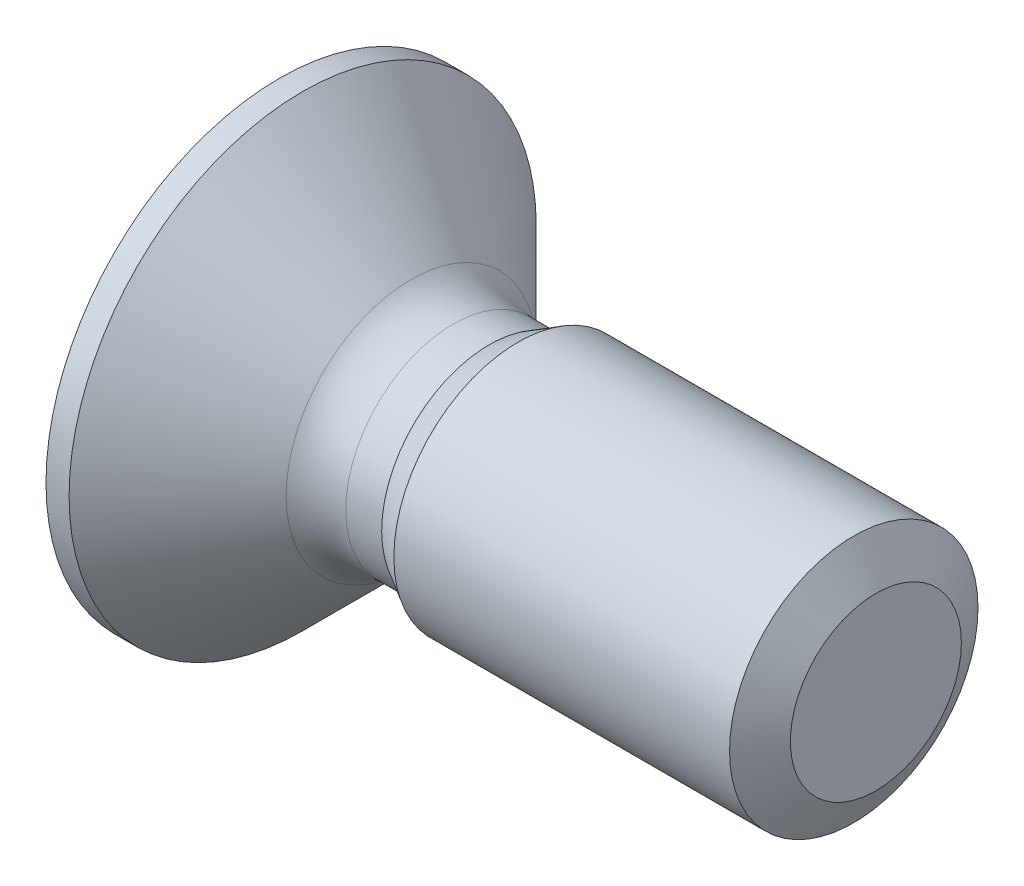
ISO-10303-21;
HEADER;
FILE_DESCRIPTION(('STEP AP214'),'2;1');
FILE_NAME('part.step','',(''),(''),'','','');
FILE_SCHEMA(('AUTOMOTIVE_DESIGN { 1 0 10303 214 1 1 1 1 }'));
ENDSEC;
DATA;
#1=APPLICATION_CONTEXT('core data for automotive mechanical design processes');
#2=APPLICATION_PROTOCOL_DEFINITION('international standard','automotive_design',2000,#1);
#3=PRODUCT_CONTEXT('',#1,'mechanical');
#4=PRODUCT('Part','Part','',(#3));
#5=PRODUCT_RELATED_PRODUCT_CATEGORY('part','',(#4));
#6=PRODUCT_DEFINITION_FORMATION('','',#4);
#7=PRODUCT_DEFINITION_CONTEXT('part definition',#1,'design');
#8=PRODUCT_DEFINITION('design','',#6,#7);
#9=PRODUCT_DEFINITION_SHAPE('','',#8);
#10=(LENGTH_UNIT() NAMED_UNIT(*) SI_UNIT(.MILLI.,.METRE.));
#11=(NAMED_UNIT(*) PLANE_ANGLE_UNIT() SI_UNIT($,.RADIAN.));
#12=(NAMED_UNIT(*) SI_UNIT($,.STERADIAN.) SOLID_ANGLE_UNIT());
#13=UNCERTAINTY_MEASURE_WITH_UNIT(LENGTH_MEASURE(1.E-05),#10,'distance_accuracy_value','');
#14=(GEOMETRIC_REPRESENTATION_CONTEXT(3) GLOBAL_UNCERTAINTY_ASSIGNED_CONTEXT((#13)) GLOBAL_UNIT_ASSIGNED_CONTEXT((#10,
#11,#12)) REPRESENTATION_CONTEXT('',''));
#15=CARTESIAN_POINT('',(0.,0.,0.));
#16=DIRECTION('',(0.,0.,1.));
#17=DIRECTION('',(1.,0.,0.));
#18=AXIS2_PLACEMENT_3D('',#15,#16,#17);
#19=CARTESIAN_POINT('',(0.,0.,0.));
#20=DIRECTION('',(1.,0.,0.));
#21=DIRECTION('',(0.,0.,-1.));
#22=AXIS2_PLACEMENT_3D('',#19,#20,#21);
#23=PLANE('',#22);
#24=CARTESIAN_POINT('',(0.,0.,0.));
#25=DIRECTION('',(-1.,0.,0.));
#26=DIRECTION('',(0.,0.,1.));
#27=AXIS2_PLACEMENT_3D('',#24,#25,#26);
#28=CIRCLE('',#27,2.35);
#29=CARTESIAN_POINT('',(0.,0.,2.35));
#30=VERTEX_POINT('',#29);
#31=EDGE_CURVE('E210',#30,#30,#28,.T.);
#32=ORIENTED_EDGE('',*,*,#31,.T.);
#33=EDGE_LOOP('',(#32));
#34=FACE_BOUND('',#33,.T.);
#35=DIRECTION('',(0.,1.,0.));
#36=VECTOR('',#35,1.);
#37=CARTESIAN_POINT('',(0.,1.45,0.225000000000005));
#38=LINE('',#37,#36);
#39=CARTESIAN_POINT('',(0.,0.225,0.225000000000001));
#40=VERTEX_POINT('',#39);
#41=CARTESIAN_POINT('',(0.,1.45,0.225000000000005));
#42=VERTEX_POINT('',#41);
#43=EDGE_CURVE('E108',#40,#42,#38,.T.);
#44=ORIENTED_EDGE('',*,*,#43,.F.);
#45=DIRECTION('',(0.,0.,-1.));
#46=VECTOR('',#45,1.);
#47=CARTESIAN_POINT('',(0.,0.225,-1.45));
#48=LINE('',#47,#46);
#49=CARTESIAN_POINT('',(0.,0.225,1.45));
#50=VERTEX_POINT('',#49);
#51=EDGE_CURVE('E166',#50,#40,#48,.T.);
#52=ORIENTED_EDGE('',*,*,#51,.F.);
#53=DIRECTION('',(0.,1.,0.));
#54=VECTOR('',#53,1.);
#55=CARTESIAN_POINT('',(0.,0.225,1.45));
#56=LINE('',#55,#54);
#57=CARTESIAN_POINT('',(0.,-0.225,1.45));
#58=VERTEX_POINT('',#57);
#59=EDGE_CURVE('E162',#58,#50,#56,.T.);
#60=ORIENTED_EDGE('',*,*,#59,.F.);
#61=DIRECTION('',(0.,0.,1.));
#62=VECTOR('',#61,1.);
#63=CARTESIAN_POINT('',(0.,-0.225,-1.45));
#64=LINE('',#63,#62);
#65=CARTESIAN_POINT('',(0.,-0.225,0.224999999999999));
#66=VERTEX_POINT('',#65);
#67=EDGE_CURVE('E81',#66,#58,#64,.T.);
#68=ORIENTED_EDGE('',*,*,#67,.F.);
#69=CARTESIAN_POINT('',(0.,-1.45,0.224999999999995));
#70=VERTEX_POINT('',#69);
#71=EDGE_CURVE('E117',#70,#66,#38,.T.);
#72=ORIENTED_EDGE('',*,*,#71,.F.);
#73=DIRECTION('',(0.,0.,1.));
#74=VECTOR('',#73,1.);
#75=CARTESIAN_POINT('',(0.,-1.45,0.224999999999995));
#76=LINE('',#75,#74);
#77=CARTESIAN_POINT('',(0.,-1.45,-0.225000000000005));
#78=VERTEX_POINT('',#77);
#79=EDGE_CURVE('E118',#78,#70,#76,.T.);
#80=ORIENTED_EDGE('',*,*,#79,.F.);
#81=DIRECTION('',(0.,-1.,0.));
#82=VECTOR('',#81,1.);
#83=CARTESIAN_POINT('',(0.,1.45,-0.224999999999995));
#84=LINE('',#83,#82);
#85=CARTESIAN_POINT('',(0.,-0.225,-0.225000000000001));
#86=VERTEX_POINT('',#85);
#87=EDGE_CURVE('E133',#86,#78,#84,.T.);
#88=ORIENTED_EDGE('',*,*,#87,.F.);
#89=CARTESIAN_POINT('',(0.,-0.225,-1.45));
#90=VERTEX_POINT('',#89);
#91=EDGE_CURVE('E158',#90,#86,#64,.T.);
#92=ORIENTED_EDGE('',*,*,#91,.F.);
#93=DIRECTION('',(0.,-1.,0.));
#94=VECTOR('',#93,1.);
#95=CARTESIAN_POINT('',(0.,0.225,-1.45));
#96=LINE('',#95,#94);
#97=CARTESIAN_POINT('',(0.,0.225,-1.45));
#98=VERTEX_POINT('',#97);
#99=EDGE_CURVE('E58',#98,#90,#96,.T.);
#100=ORIENTED_EDGE('',*,*,#99,.F.);
#101=CARTESIAN_POINT('',(0.,0.225,-0.224999999999999));
#102=VERTEX_POINT('',#101);
#103=EDGE_CURVE('E170',#102,#98,#48,.T.);
#104=ORIENTED_EDGE('',*,*,#103,.F.);
#105=CARTESIAN_POINT('',(0.,1.45,-0.224999999999995));
#106=VERTEX_POINT('',#105);
#107=EDGE_CURVE('E131',#106,#102,#84,.T.);
#108=ORIENTED_EDGE('',*,*,#107,.F.);
#109=DIRECTION('',(0.,0.,-1.));
#110=VECTOR('',#109,1.);
#111=CARTESIAN_POINT('',(0.,1.45,0.225000000000005));
#112=LINE('',#111,#110);
#113=EDGE_CURVE('E123',#42,#106,#112,.T.);
#114=ORIENTED_EDGE('',*,*,#113,.F.);
#115=EDGE_LOOP('',(#44,#52,#60,#68,#72,#80,#88,#92,#100,#104,#108,#114));
#116=FACE_BOUND('',#115,.T.);
#117=ADVANCED_FACE('F43',(#34,#116),#23,.F.);
#118=CARTESIAN_POINT('',(1.8,0.,0.));
#119=DIRECTION('',(-0.124034734589208,-0.992277876713668,0.));
#120=DIRECTION('',(0.992277876713668,-0.124034734589208,0.));
#121=AXIS2_PLACEMENT_3D('',#118,#119,#120);
#122=PLANE('',#121);
#123=ORIENTED_EDGE('',*,*,#51,.T.);
#124=DIRECTION('',(0.984731927834662,-0.123091490979333,-0.123091490979333));
#125=VECTOR('',#124,1.);
#126=CARTESIAN_POINT('',(1.8,0.,0.));
#127=LINE('',#126,#125);
#128=CARTESIAN_POINT('',(1.8,0.,0.));
#129=VERTEX_POINT('',#128);
#130=EDGE_CURVE('E87',#40,#129,#127,.T.);
#131=ORIENTED_EDGE('',*,*,#130,.T.);
#132=DIRECTION('',(0.775090228729781,-0.0968862785912226,-0.624378239810101));
#133=VECTOR('',#132,1.);
#134=CARTESIAN_POINT('',(0.,0.225,1.45));
#135=LINE('',#134,#133);
#136=EDGE_CURVE('E67',#50,#129,#135,.T.);
#137=ORIENTED_EDGE('',*,*,#136,.F.);
#138=EDGE_LOOP('',(#123,#131,#137));
#139=FACE_BOUND('',#138,.T.);
#140=ADVANCED_FACE('F228',(#139),#122,.T.);
#141=DIRECTION('',(0.775090228729781,-0.0968862785912226,0.624378239810101));
#142=VECTOR('',#141,1.);
#143=CARTESIAN_POINT('',(0.,0.225,-1.45));
#144=LINE('',#143,#142);
#145=EDGE_CURVE('E165',#98,#129,#144,.T.);
#146=ORIENTED_EDGE('',*,*,#145,.T.);
#147=DIRECTION('',(-0.984731927834662,0.123091490979333,-0.123091490979332));
#148=VECTOR('',#147,1.);
#149=CARTESIAN_POINT('',(1.8,0.,0.));
#150=LINE('',#149,#148);
#151=EDGE_CURVE('E139',#129,#102,#150,.T.);
#152=ORIENTED_EDGE('',*,*,#151,.T.);
#153=ORIENTED_EDGE('',*,*,#103,.T.);
#154=EDGE_LOOP('',(#146,#152,#153));
#155=FACE_BOUND('',#154,.T.);
#156=ADVANCED_FACE('F222',(#155),#122,.T.);
#157=CARTESIAN_POINT('',(1.8,0.,0.));
#158=DIRECTION('',(-0.124034734589208,0.992277876713668,0.));
#159=DIRECTION('',(-0.992277876713668,-0.124034734589208,0.));
#160=AXIS2_PLACEMENT_3D('',#157,#158,#159);
#161=PLANE('',#160);
#162=DIRECTION('',(0.775090228729781,0.0968862785912226,-0.624378239810101));
#163=VECTOR('',#162,1.);
#164=CARTESIAN_POINT('',(0.,-0.225,1.45));
#165=LINE('',#164,#163);
#166=EDGE_CURVE('E157',#58,#129,#165,.T.);
#167=ORIENTED_EDGE('',*,*,#166,.T.);
#168=DIRECTION('',(-0.984731927834662,-0.123091490979333,0.123091490979332));
#169=VECTOR('',#168,1.);
#170=CARTESIAN_POINT('',(1.8,0.,0.));
#171=LINE('',#170,#169);
#172=EDGE_CURVE('E11',#129,#66,#171,.T.);
#173=ORIENTED_EDGE('',*,*,#172,.T.);
#174=ORIENTED_EDGE('',*,*,#67,.T.);
#175=EDGE_LOOP('',(#167,#173,#174));
#176=FACE_BOUND('',#175,.T.);
#177=ADVANCED_FACE('F223',(#176),#161,.T.);
#178=ORIENTED_EDGE('',*,*,#91,.T.);
#179=DIRECTION('',(0.984731927834662,0.123091490979333,0.123091490979333));
#180=VECTOR('',#179,1.);
#181=CARTESIAN_POINT('',(1.8,0.,0.));
#182=LINE('',#181,#180);
#183=EDGE_CURVE('E51',#86,#129,#182,.T.);
#184=ORIENTED_EDGE('',*,*,#183,.T.);
#185=DIRECTION('',(0.775090228729781,0.0968862785912226,0.624378239810101));
#186=VECTOR('',#185,1.);
#187=CARTESIAN_POINT('',(0.,-0.225,-1.45));
#188=LINE('',#187,#186);
#189=EDGE_CURVE('E178',#90,#129,#188,.T.);
#190=ORIENTED_EDGE('',*,*,#189,.F.);
#191=EDGE_LOOP('',(#178,#184,#190));
#192=FACE_BOUND('',#191,.T.);
#193=ADVANCED_FACE('F216',(#192),#161,.T.);
#194=CARTESIAN_POINT('',(0.,0.,0.));
#195=DIRECTION('',(-1.,0.,0.));
#196=DIRECTION('',(0.,0.,1.));
#197=AXIS2_PLACEMENT_3D('',#194,#195,#196);
#198=CYLINDRICAL_SURFACE('',#197,2.35);
#199=ORIENTED_EDGE('',*,*,#31,.F.);
#200=EDGE_LOOP('',(#199));
#201=FACE_BOUND('',#200,.T.);
#202=CARTESIAN_POINT('',(0.232500000000005,0.,0.));
#203=DIRECTION('',(-1.,0.,0.));
#204=DIRECTION('',(0.,0.,1.));
#205=AXIS2_PLACEMENT_3D('',#202,#203,#204);
#206=CIRCLE('',#205,2.35);
#207=CARTESIAN_POINT('',(0.232500000000005,0.,2.35));
#208=VERTEX_POINT('',#207);
#209=EDGE_CURVE('E206',#208,#208,#206,.T.);
#210=ORIENTED_EDGE('',*,*,#209,.T.);
#211=EDGE_LOOP('',(#210));
#212=FACE_BOUND('',#211,.T.);
#213=ADVANCED_FACE('F259',(#201,#212),#198,.T.);
#214=CARTESIAN_POINT('',(1.32426406871193,0.,0.));
#215=DIRECTION('',(-1.,0.,0.));
#216=DIRECTION('',(0.,0.,1.));
#217=AXIS2_PLACEMENT_3D('',#214,#215,#216);
#218=CONICAL_SURFACE('',#217,1.25823593128807,0.78539816339745);
#219=ORIENTED_EDGE('',*,*,#209,.F.);
#220=EDGE_LOOP('',(#219));
#221=FACE_BOUND('',#220,.T.);
#222=CARTESIAN_POINT('',(1.32426406871193,0.,0.));
#223=DIRECTION('',(-1.,0.,0.));
#224=DIRECTION('',(0.,0.,1.));
#225=AXIS2_PLACEMENT_3D('',#222,#223,#224);
#226=CIRCLE('',#225,1.25823593128807);
#227=CARTESIAN_POINT('',(1.32426406871193,0.,1.25823593128807));
#228=VERTEX_POINT('',#227);
#229=EDGE_CURVE('E202',#228,#228,#226,.T.);
#230=ORIENTED_EDGE('',*,*,#229,.T.);
#231=EDGE_LOOP('',(#230));
#232=FACE_BOUND('',#231,.T.);
#233=ADVANCED_FACE('F262',(#221,#232),#218,.T.);
#234=CARTESIAN_POINT('',(1.74852813742386,0.,0.));
#235=DIRECTION('',(-1.,0.,0.));
#236=DIRECTION('',(0.,0.,1.));
#237=AXIS2_PLACEMENT_3D('',#234,#235,#236);
#238=TOROIDAL_SURFACE('',#237,1.6825,0.6);
#239=ORIENTED_EDGE('',*,*,#229,.F.);
#240=EDGE_LOOP('',(#239));
#241=FACE_BOUND('',#240,.T.);
#242=CARTESIAN_POINT('',(1.74852813742386,0.,0.));
#243=DIRECTION('',(-1.,0.,0.));
#244=DIRECTION('',(0.,0.,1.));
#245=AXIS2_PLACEMENT_3D('',#242,#243,#244);
#246=CIRCLE('',#245,1.0825);
#247=CARTESIAN_POINT('',(1.74852813742386,0.,1.0825));
#248=VERTEX_POINT('',#247);
#249=EDGE_CURVE('E198',#248,#248,#246,.T.);
#250=ORIENTED_EDGE('',*,*,#249,.T.);
#251=EDGE_LOOP('',(#250));
#252=FACE_BOUND('',#251,.T.);
#253=ADVANCED_FACE('F267',(#241,#252),#238,.F.);
#254=CARTESIAN_POINT('',(0.,0.,0.));
#255=DIRECTION('',(-1.,0.,0.));
#256=DIRECTION('',(0.,0.,1.));
#257=AXIS2_PLACEMENT_3D('',#254,#255,#256);
#258=CYLINDRICAL_SURFACE('',#257,1.0825);
#259=ORIENTED_EDGE('',*,*,#249,.F.);
#260=EDGE_LOOP('',(#259));
#261=FACE_BOUND('',#260,.T.);
#262=CARTESIAN_POINT('',(2.10988148973221,0.,0.));
#263=DIRECTION('',(-1.,0.,0.));
#264=DIRECTION('',(0.,0.,1.));
#265=AXIS2_PLACEMENT_3D('',#262,#263,#264);
#266=CIRCLE('',#265,1.0825);
#267=CARTESIAN_POINT('',(2.10988148973221,0.,1.0825));
#268=VERTEX_POINT('',#267);
#269=EDGE_CURVE('E194',#268,#268,#266,.T.);
#270=ORIENTED_EDGE('',*,*,#269,.T.);
#271=EDGE_LOOP('',(#270));
#272=FACE_BOUND('',#271,.T.);
#273=ADVANCED_FACE('F273',(#261,#272),#258,.T.);
#274=CARTESIAN_POINT('',(2.4,0.,0.));
#275=DIRECTION('',(1.,0.,0.));
#276=DIRECTION('',(0.,0.,-1.));
#277=AXIS2_PLACEMENT_3D('',#274,#275,#276);
#278=CONICAL_SURFACE('',#277,1.25,0.5235987755983);
#279=ORIENTED_EDGE('',*,*,#269,.F.);
#280=EDGE_LOOP('',(#279));
#281=FACE_BOUND('',#280,.T.);
#282=CARTESIAN_POINT('',(2.4,0.,0.));
#283=DIRECTION('',(-1.,0.,0.));
#284=DIRECTION('',(0.,0.,1.));
#285=AXIS2_PLACEMENT_3D('',#282,#283,#284);
#286=CIRCLE('',#285,1.25);
#287=CARTESIAN_POINT('',(2.4,0.,1.25));
#288=VERTEX_POINT('',#287);
#289=EDGE_CURVE('E190',#288,#288,#286,.T.);
#290=ORIENTED_EDGE('',*,*,#289,.T.);
#291=EDGE_LOOP('',(#290));
#292=FACE_BOUND('',#291,.T.);
#293=ADVANCED_FACE('F279',(#281,#292),#278,.T.);
#294=CARTESIAN_POINT('',(0.,0.,0.));
#295=DIRECTION('',(-1.,0.,0.));
#296=DIRECTION('',(0.,0.,1.));
#297=AXIS2_PLACEMENT_3D('',#294,#295,#296);
#298=CYLINDRICAL_SURFACE('',#297,1.25);
#299=CARTESIAN_POINT('',(5.77743720258411,0.,0.));
#300=DIRECTION('',(1.,0.,0.));
#301=DIRECTION('',(0.,0.,-1.));
#302=AXIS2_PLACEMENT_3D('',#299,#300,#301);
#303=CIRCLE('',#302,1.25);
#304=CARTESIAN_POINT('',(5.77743720258411,0.,-1.25));
#305=VERTEX_POINT('',#304);
#306=EDGE_CURVE('E186',#305,#305,#303,.T.);
#307=ORIENTED_EDGE('',*,*,#306,.F.);
#308=EDGE_LOOP('',(#307));
#309=FACE_BOUND('',#308,.T.);
#310=ORIENTED_EDGE('',*,*,#289,.F.);
#311=EDGE_LOOP('',(#310));
#312=FACE_BOUND('',#311,.T.);
#313=ADVANCED_FACE('F285',(#309,#312),#298,.T.);
#314=CARTESIAN_POINT('',(5.77743720258411,0.,0.));
#315=DIRECTION('',(-1.,0.,0.));
#316=DIRECTION('',(0.,0.,1.));
#317=AXIS2_PLACEMENT_3D('',#314,#315,#316);
#318=CONICAL_SURFACE('',#317,1.25,1.05188801855134);
#319=CARTESIAN_POINT('',(6.,0.,0.));
#320=DIRECTION('',(1.,0.,0.));
#321=DIRECTION('',(0.,0.,-1.));
#322=AXIS2_PLACEMENT_3D('',#319,#320,#321);
#323=CIRCLE('',#322,0.8603);
#324=CARTESIAN_POINT('',(6.,0.,-0.8603));
#325=VERTEX_POINT('',#324);
#326=EDGE_CURVE('E169',#325,#325,#323,.T.);
#327=ORIENTED_EDGE('',*,*,#326,.F.);
#328=EDGE_LOOP('',(#327));
#329=FACE_BOUND('',#328,.T.);
#330=ORIENTED_EDGE('',*,*,#306,.T.);
#331=EDGE_LOOP('',(#330));
#332=FACE_BOUND('',#331,.T.);
#333=ADVANCED_FACE('F290',(#329,#332),#318,.T.);
#334=CARTESIAN_POINT('',(6.,1.25,0.));
#335=DIRECTION('',(-1.,0.,0.));
#336=DIRECTION('',(0.,0.,1.));
#337=AXIS2_PLACEMENT_3D('',#334,#335,#336);
#338=PLANE('',#337);
#339=ORIENTED_EDGE('',*,*,#326,.T.);
#340=EDGE_LOOP('',(#339));
#341=FACE_BOUND('',#340,.T.);
#342=ADVANCED_FACE('F296',(#341),#338,.F.);
#343=CARTESIAN_POINT('',(0.,0.225,-1.45));
#344=DIRECTION('',(0.627329537872645,0.,-0.778753909083283));
#345=DIRECTION('',(-0.778753909083283,0.,-0.627329537872645));
#346=AXIS2_PLACEMENT_3D('',#343,#344,#345);
#347=PLANE('',#346);
#348=ORIENTED_EDGE('',*,*,#145,.F.);
#349=ORIENTED_EDGE('',*,*,#99,.T.);
#350=ORIENTED_EDGE('',*,*,#189,.T.);
#351=EDGE_LOOP('',(#348,#349,#350));
#352=FACE_BOUND('',#351,.T.);
#353=ADVANCED_FACE('F220',(#352),#347,.F.);
#354=CARTESIAN_POINT('',(0.,-0.225,1.45));
#355=DIRECTION('',(0.627329537872645,0.,0.778753909083283));
#356=DIRECTION('',(0.778753909083283,0.,-0.627329537872645));
#357=AXIS2_PLACEMENT_3D('',#354,#355,#356);
#358=PLANE('',#357);
#359=ORIENTED_EDGE('',*,*,#166,.F.);
#360=ORIENTED_EDGE('',*,*,#59,.T.);
#361=ORIENTED_EDGE('',*,*,#136,.T.);
#362=EDGE_LOOP('',(#359,#360,#361));
#363=FACE_BOUND('',#362,.T.);
#364=ADVANCED_FACE('F227',(#363),#358,.F.);
#365=CARTESIAN_POINT('',(1.8,0.,0.));
#366=DIRECTION('',(-0.124034734589208,0.,-0.992277876713668));
#367=DIRECTION('',(0.992277876713668,0.,-0.124034734589208));
#368=AXIS2_PLACEMENT_3D('',#365,#366,#367);
#369=PLANE('',#368);
#370=DIRECTION('',(0.775090228729781,0.624378239810101,-0.0968862785912204));
#371=VECTOR('',#370,1.);
#372=CARTESIAN_POINT('',(0.,-1.45,0.224999999999995));
#373=LINE('',#372,#371);
#374=EDGE_CURVE('E128',#70,#129,#373,.T.);
#375=ORIENTED_EDGE('',*,*,#374,.F.);
#376=ORIENTED_EDGE('',*,*,#71,.T.);
#377=ORIENTED_EDGE('',*,*,#172,.F.);
#378=EDGE_LOOP('',(#375,#376,#377));
#379=FACE_BOUND('',#378,.T.);
#380=ADVANCED_FACE('F240',(#379),#369,.T.);
#381=CARTESIAN_POINT('',(1.8,0.,0.));
#382=DIRECTION('',(-0.124034734589208,0.,0.992277876713668));
#383=DIRECTION('',(-0.992277876713668,0.,-0.124034734589208));
#384=AXIS2_PLACEMENT_3D('',#381,#382,#383);
#385=PLANE('',#384);
#386=ORIENTED_EDGE('',*,*,#87,.T.);
#387=DIRECTION('',(0.775090228729781,0.624378239810101,0.0968862785912248));
#388=VECTOR('',#387,1.);
#389=CARTESIAN_POINT('',(0.,-1.45,-0.225000000000005));
#390=LINE('',#389,#388);
#391=EDGE_CURVE('E148',#78,#129,#390,.T.);
#392=ORIENTED_EDGE('',*,*,#391,.T.);
#393=ORIENTED_EDGE('',*,*,#183,.F.);
#394=EDGE_LOOP('',(#386,#392,#393));
#395=FACE_BOUND('',#394,.T.);
#396=ADVANCED_FACE('F239',(#395),#385,.T.);
#397=CARTESIAN_POINT('',(0.,-1.45,-0.225000000000005));
#398=DIRECTION('',(0.627329537872645,-0.778753909083283,0.));
#399=DIRECTION('',(0.778753909083283,0.627329537872645,0.));
#400=AXIS2_PLACEMENT_3D('',#397,#398,#399);
#401=PLANE('',#400);
#402=ORIENTED_EDGE('',*,*,#391,.F.);
#403=ORIENTED_EDGE('',*,*,#79,.T.);
#404=ORIENTED_EDGE('',*,*,#374,.T.);
#405=EDGE_LOOP('',(#402,#403,#404));
#406=FACE_BOUND('',#405,.T.);
#407=ADVANCED_FACE('F237',(#406),#401,.F.);
#408=ORIENTED_EDGE('',*,*,#43,.T.);
#409=DIRECTION('',(0.775090228729781,-0.624378239810101,-0.0968862785912248));
#410=VECTOR('',#409,1.);
#411=CARTESIAN_POINT('',(0.,1.45,0.225000000000005));
#412=LINE('',#411,#410);
#413=EDGE_CURVE('E111',#42,#129,#412,.T.);
#414=ORIENTED_EDGE('',*,*,#413,.T.);
#415=ORIENTED_EDGE('',*,*,#130,.F.);
#416=EDGE_LOOP('',(#408,#414,#415));
#417=FACE_BOUND('',#416,.T.);
#418=ADVANCED_FACE('F110',(#417),#369,.T.);
#419=DIRECTION('',(0.775090228729781,-0.624378239810101,0.0968862785912204));
#420=VECTOR('',#419,1.);
#421=CARTESIAN_POINT('',(0.,1.45,-0.224999999999995));
#422=LINE('',#421,#420);
#423=EDGE_CURVE('E125',#106,#129,#422,.T.);
#424=ORIENTED_EDGE('',*,*,#423,.F.);
#425=ORIENTED_EDGE('',*,*,#107,.T.);
#426=ORIENTED_EDGE('',*,*,#151,.F.);
#427=EDGE_LOOP('',(#424,#425,#426));
#428=FACE_BOUND('',#427,.T.);
#429=ADVANCED_FACE('F234',(#428),#385,.T.);
#430=CARTESIAN_POINT('',(0.,1.45,0.225000000000005));
#431=DIRECTION('',(0.627329537872645,0.778753909083283,0.));
#432=DIRECTION('',(-0.778753909083283,0.627329537872645,0.));
#433=AXIS2_PLACEMENT_3D('',#430,#431,#432);
#434=PLANE('',#433);
#435=ORIENTED_EDGE('',*,*,#413,.F.);
#436=ORIENTED_EDGE('',*,*,#113,.T.);
#437=ORIENTED_EDGE('',*,*,#423,.T.);
#438=EDGE_LOOP('',(#435,#436,#437));
#439=FACE_BOUND('',#438,.T.);
#440=ADVANCED_FACE('F122',(#439),#434,.F.);
#441=CLOSED_SHELL('',(#117,#140,#156,#177,#193,#213,#233,#253,#273,#293,#313,#333,#342,#353,
#364,#380,#396,#407,#418,#429,#440));
#442=MANIFOLD_SOLID_BREP('B2',#441);
#443=ADVANCED_BREP_SHAPE_REPRESENTATION('',(#18,#442),#14);
#444=SHAPE_DEFINITION_REPRESENTATION(#9,#443);
ENDSEC;
END-ISO-10303-21;
